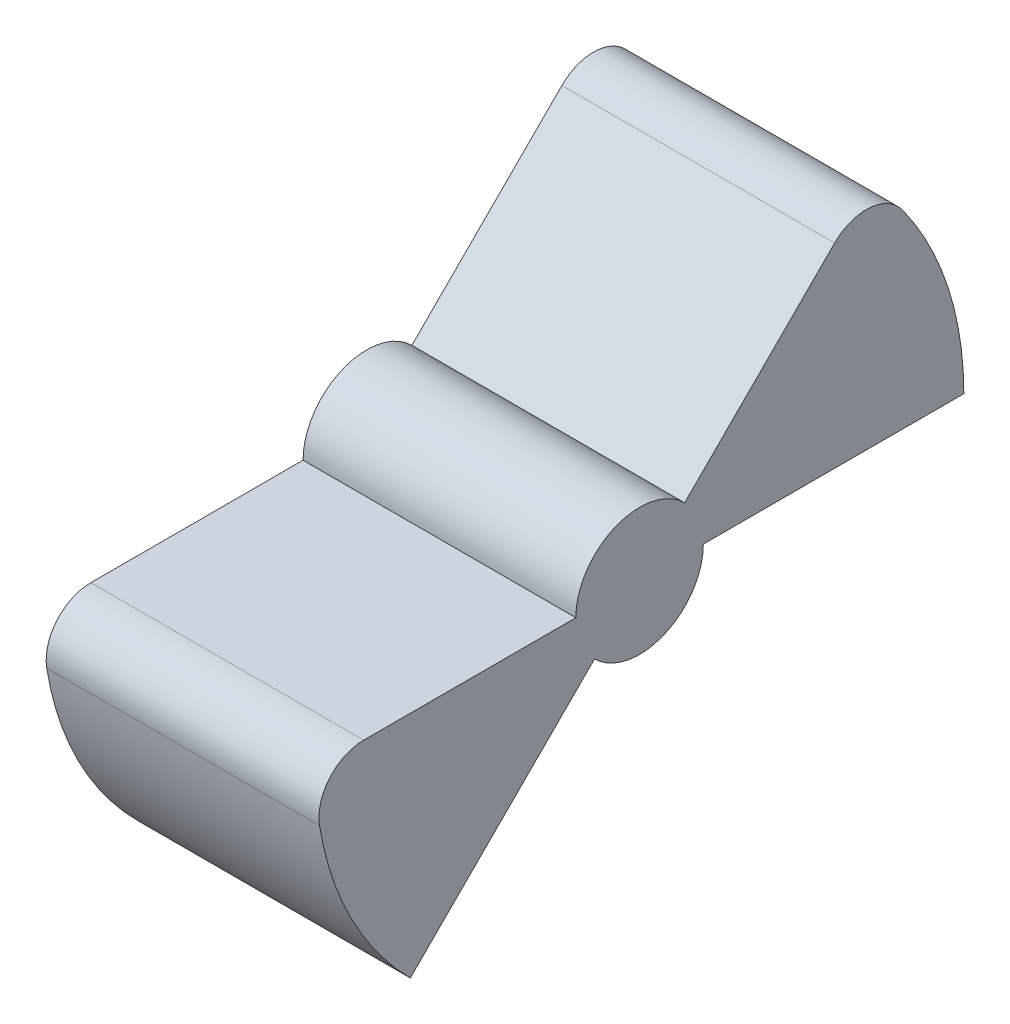
ISO-10303-21;
HEADER;
FILE_DESCRIPTION(('STEP AP214'),'2;1');
FILE_NAME('part.step','',(''),(''),'','','');
FILE_SCHEMA(('AUTOMOTIVE_DESIGN { 1 0 10303 214 1 1 1 1 }'));
ENDSEC;
DATA;
#1=APPLICATION_CONTEXT('core data for automotive mechanical design processes');
#2=APPLICATION_PROTOCOL_DEFINITION('international standard','automotive_design',2000,#1);
#3=PRODUCT_CONTEXT('',#1,'mechanical');
#4=PRODUCT('Part','Part','',(#3));
#5=PRODUCT_RELATED_PRODUCT_CATEGORY('part','',(#4));
#6=PRODUCT_DEFINITION_FORMATION('','',#4);
#7=PRODUCT_DEFINITION_CONTEXT('part definition',#1,'design');
#8=PRODUCT_DEFINITION('design','',#6,#7);
#9=PRODUCT_DEFINITION_SHAPE('','',#8);
#10=(LENGTH_UNIT() NAMED_UNIT(*) SI_UNIT(.MILLI.,.METRE.));
#11=(NAMED_UNIT(*) PLANE_ANGLE_UNIT() SI_UNIT($,.RADIAN.));
#12=(NAMED_UNIT(*) SI_UNIT($,.STERADIAN.) SOLID_ANGLE_UNIT());
#13=UNCERTAINTY_MEASURE_WITH_UNIT(LENGTH_MEASURE(1.E-05),#10,'distance_accuracy_value','');
#14=(GEOMETRIC_REPRESENTATION_CONTEXT(3) GLOBAL_UNCERTAINTY_ASSIGNED_CONTEXT((#13)) GLOBAL_UNIT_ASSIGNED_CONTEXT((#10,
#11,#12)) REPRESENTATION_CONTEXT('',''));
#15=CARTESIAN_POINT('',(0.,0.,0.));
#16=DIRECTION('',(0.,0.,1.));
#17=DIRECTION('',(1.,0.,0.));
#18=AXIS2_PLACEMENT_3D('',#15,#16,#17);
#19=CARTESIAN_POINT('',(6.1,0.,0.));
#20=DIRECTION('',(-1.,0.,0.));
#21=DIRECTION('',(0.,0.,1.));
#22=AXIS2_PLACEMENT_3D('',#19,#20,#21);
#23=CYLINDRICAL_SURFACE('',#22,2.85);
#24=CARTESIAN_POINT('',(-6.1,0.,0.));
#25=DIRECTION('',(1.,0.,0.));
#26=DIRECTION('',(0.,0.,-1.));
#27=AXIS2_PLACEMENT_3D('',#24,#25,#26);
#28=CIRCLE('',#27,2.85);
#29=CARTESIAN_POINT('',(-6.1,2.01525432638165,-2.01525432638167));
#30=VERTEX_POINT('',#29);
#31=CARTESIAN_POINT('',(-6.1,0.,2.85));
#32=VERTEX_POINT('',#31);
#33=EDGE_CURVE('E144',#30,#32,#28,.T.);
#34=ORIENTED_EDGE('',*,*,#33,.T.);
#35=DIRECTION('',(-1.,0.,0.));
#36=VECTOR('',#35,1.);
#37=CARTESIAN_POINT('',(6.1,0.,2.85));
#38=LINE('',#37,#36);
#39=CARTESIAN_POINT('',(6.1,0.,2.85));
#40=VERTEX_POINT('',#39);
#41=EDGE_CURVE('E11',#40,#32,#38,.T.);
#42=ORIENTED_EDGE('',*,*,#41,.F.);
#43=CARTESIAN_POINT('',(6.1,0.,0.));
#44=DIRECTION('',(1.,0.,0.));
#45=DIRECTION('',(0.,0.,-1.));
#46=AXIS2_PLACEMENT_3D('',#43,#44,#45);
#47=CIRCLE('',#46,2.85);
#48=CARTESIAN_POINT('',(6.1,2.01525432638165,-2.01525432638167));
#49=VERTEX_POINT('',#48);
#50=EDGE_CURVE('E162',#49,#40,#47,.T.);
#51=ORIENTED_EDGE('',*,*,#50,.F.);
#52=DIRECTION('',(-1.,0.,0.));
#53=VECTOR('',#52,1.);
#54=CARTESIAN_POINT('',(6.1,2.01525432638165,-2.01525432638167));
#55=LINE('',#54,#53);
#56=EDGE_CURVE('E140',#49,#30,#55,.T.);
#57=ORIENTED_EDGE('',*,*,#56,.T.);
#58=EDGE_LOOP('',(#34,#42,#51,#57));
#59=FACE_BOUND('',#58,.T.);
#60=ADVANCED_FACE('F36',(#59),#23,.T.);
#61=CARTESIAN_POINT('',(6.1,0.,2.85));
#62=DIRECTION('',(0.,-1.,0.));
#63=DIRECTION('',(0.,0.,-1.));
#64=AXIS2_PLACEMENT_3D('',#61,#62,#63);
#65=PLANE('',#64);
#66=DIRECTION('',(0.,0.,1.));
#67=VECTOR('',#66,1.);
#68=CARTESIAN_POINT('',(-6.1,0.,2.85));
#69=LINE('',#68,#67);
#70=CARTESIAN_POINT('',(-6.1,0.,12.3389626792531));
#71=VERTEX_POINT('',#70);
#72=EDGE_CURVE('E147',#32,#71,#69,.T.);
#73=ORIENTED_EDGE('',*,*,#72,.T.);
#74=DIRECTION('',(-1.,0.,0.));
#75=VECTOR('',#74,1.);
#76=CARTESIAN_POINT('',(6.1,0.,12.3389626792531));
#77=LINE('',#76,#75);
#78=CARTESIAN_POINT('',(6.1,0.,12.3389626792531));
#79=VERTEX_POINT('',#78);
#80=EDGE_CURVE('E44',#79,#71,#77,.T.);
#81=ORIENTED_EDGE('',*,*,#80,.F.);
#82=DIRECTION('',(0.,0.,1.));
#83=VECTOR('',#82,1.);
#84=CARTESIAN_POINT('',(6.1,0.,2.85));
#85=LINE('',#84,#83);
#86=EDGE_CURVE('E101',#40,#79,#85,.T.);
#87=ORIENTED_EDGE('',*,*,#86,.F.);
#88=ORIENTED_EDGE('',*,*,#41,.T.);
#89=EDGE_LOOP('',(#73,#81,#87,#88));
#90=FACE_BOUND('',#89,.T.);
#91=ADVANCED_FACE('F211',(#90),#65,.F.);
#92=CARTESIAN_POINT('',(6.1,-2.,12.3389626792531));
#93=DIRECTION('',(-1.,0.,0.));
#94=DIRECTION('',(0.,0.,1.));
#95=AXIS2_PLACEMENT_3D('',#92,#93,#94);
#96=CYLINDRICAL_SURFACE('',#95,2.);
#97=CARTESIAN_POINT('',(-6.1,-2.,12.3389626792531));
#98=DIRECTION('',(1.,0.,0.));
#99=DIRECTION('',(0.,0.,-1.));
#100=AXIS2_PLACEMENT_3D('',#97,#98,#99);
#101=CIRCLE('',#100,2.);
#102=CARTESIAN_POINT('',(-6.1,-2.32,14.3131967079336));
#103=VERTEX_POINT('',#102);
#104=EDGE_CURVE('E149',#71,#103,#101,.T.);
#105=ORIENTED_EDGE('',*,*,#104,.T.);
#106=DIRECTION('',(-1.,0.,0.));
#107=VECTOR('',#106,1.);
#108=CARTESIAN_POINT('',(6.1,-2.32,14.3131967079336));
#109=LINE('',#108,#107);
#110=CARTESIAN_POINT('',(6.1,-2.32,14.3131967079336));
#111=VERTEX_POINT('',#110);
#112=EDGE_CURVE('E175',#111,#103,#109,.T.);
#113=ORIENTED_EDGE('',*,*,#112,.F.);
#114=CARTESIAN_POINT('',(6.1,-2.,12.3389626792531));
#115=DIRECTION('',(1.,0.,0.));
#116=DIRECTION('',(0.,0.,-1.));
#117=AXIS2_PLACEMENT_3D('',#114,#115,#116);
#118=CIRCLE('',#117,2.);
#119=EDGE_CURVE('E183',#79,#111,#118,.T.);
#120=ORIENTED_EDGE('',*,*,#119,.F.);
#121=ORIENTED_EDGE('',*,*,#80,.T.);
#122=EDGE_LOOP('',(#105,#113,#120,#121));
#123=FACE_BOUND('',#122,.T.);
#124=ADVANCED_FACE('F181',(#123),#96,.T.);
#125=CARTESIAN_POINT('',(6.1,0.,0.));
#126=DIRECTION('',(-1.,0.,0.));
#127=DIRECTION('',(0.,0.,1.));
#128=AXIS2_PLACEMENT_3D('',#125,#126,#127);
#129=CYLINDRICAL_SURFACE('',#128,14.5);
#130=CARTESIAN_POINT('',(-6.1,0.,0.));
#131=DIRECTION('',(1.,0.,0.));
#132=DIRECTION('',(0.,0.,-1.));
#133=AXIS2_PLACEMENT_3D('',#130,#131,#132);
#134=CIRCLE('',#133,14.5);
#135=CARTESIAN_POINT('',(-6.1,-10.2530483272049,10.253048327205));
#136=VERTEX_POINT('',#135);
#137=EDGE_CURVE('E151',#103,#136,#134,.T.);
#138=ORIENTED_EDGE('',*,*,#137,.T.);
#139=DIRECTION('',(-1.,0.,0.));
#140=VECTOR('',#139,1.);
#141=CARTESIAN_POINT('',(6.1,-10.2530483272049,10.253048327205));
#142=LINE('',#141,#140);
#143=CARTESIAN_POINT('',(6.1,-10.2530483272049,10.253048327205));
#144=VERTEX_POINT('',#143);
#145=EDGE_CURVE('E172',#144,#136,#142,.T.);
#146=ORIENTED_EDGE('',*,*,#145,.F.);
#147=CARTESIAN_POINT('',(6.1,0.,0.));
#148=DIRECTION('',(1.,0.,0.));
#149=DIRECTION('',(0.,0.,-1.));
#150=AXIS2_PLACEMENT_3D('',#147,#148,#149);
#151=CIRCLE('',#150,14.5);
#152=EDGE_CURVE('E201',#111,#144,#151,.T.);
#153=ORIENTED_EDGE('',*,*,#152,.F.);
#154=ORIENTED_EDGE('',*,*,#112,.T.);
#155=EDGE_LOOP('',(#138,#146,#153,#154));
#156=FACE_BOUND('',#155,.T.);
#157=ADVANCED_FACE('F192',(#156),#129,.T.);
#158=CARTESIAN_POINT('',(6.1,-2.01525432638165,2.01525432638167));
#159=DIRECTION('',(0.,0.707106781186551,0.707106781186544));
#160=DIRECTION('',(0.,-0.707106781186544,0.707106781186551));
#161=AXIS2_PLACEMENT_3D('',#158,#159,#160);
#162=PLANE('',#161);
#163=DIRECTION('',(0.,0.707106781186544,-0.707106781186551));
#164=VECTOR('',#163,1.);
#165=CARTESIAN_POINT('',(-6.1,-2.01525432638165,2.01525432638167));
#166=LINE('',#165,#164);
#167=CARTESIAN_POINT('',(-6.1,-2.01525432638165,2.01525432638167));
#168=VERTEX_POINT('',#167);
#169=EDGE_CURVE('E153',#136,#168,#166,.T.);
#170=ORIENTED_EDGE('',*,*,#169,.T.);
#171=DIRECTION('',(-1.,0.,0.));
#172=VECTOR('',#171,1.);
#173=CARTESIAN_POINT('',(6.1,-2.01525432638165,2.01525432638167));
#174=LINE('',#173,#172);
#175=CARTESIAN_POINT('',(6.1,-2.01525432638165,2.01525432638167));
#176=VERTEX_POINT('',#175);
#177=EDGE_CURVE('E169',#176,#168,#174,.T.);
#178=ORIENTED_EDGE('',*,*,#177,.F.);
#179=DIRECTION('',(0.,0.707106781186544,-0.707106781186551));
#180=VECTOR('',#179,1.);
#181=CARTESIAN_POINT('',(6.1,-2.01525432638165,2.01525432638167));
#182=LINE('',#181,#180);
#183=EDGE_CURVE('E198',#144,#176,#182,.T.);
#184=ORIENTED_EDGE('',*,*,#183,.F.);
#185=ORIENTED_EDGE('',*,*,#145,.T.);
#186=EDGE_LOOP('',(#170,#178,#184,#185));
#187=FACE_BOUND('',#186,.T.);
#188=ADVANCED_FACE('F196',(#187),#162,.F.);
#189=CARTESIAN_POINT('',(6.1,0.,0.));
#190=DIRECTION('',(-1.,0.,0.));
#191=DIRECTION('',(0.,0.,1.));
#192=AXIS2_PLACEMENT_3D('',#189,#190,#191);
#193=CYLINDRICAL_SURFACE('',#192,2.85);
#194=CARTESIAN_POINT('',(-6.1,0.,0.));
#195=DIRECTION('',(1.,0.,0.));
#196=DIRECTION('',(0.,0.,-1.));
#197=AXIS2_PLACEMENT_3D('',#194,#195,#196);
#198=CIRCLE('',#197,2.85);
#199=CARTESIAN_POINT('',(-6.1,0.,-2.85));
#200=VERTEX_POINT('',#199);
#201=EDGE_CURVE('E155',#168,#200,#198,.T.);
#202=ORIENTED_EDGE('',*,*,#201,.T.);
#203=DIRECTION('',(-1.,0.,0.));
#204=VECTOR('',#203,1.);
#205=CARTESIAN_POINT('',(6.1,0.,-2.85));
#206=LINE('',#205,#204);
#207=CARTESIAN_POINT('',(6.1,0.,-2.85));
#208=VERTEX_POINT('',#207);
#209=EDGE_CURVE('E166',#208,#200,#206,.T.);
#210=ORIENTED_EDGE('',*,*,#209,.F.);
#211=CARTESIAN_POINT('',(6.1,0.,0.));
#212=DIRECTION('',(1.,0.,0.));
#213=DIRECTION('',(0.,0.,-1.));
#214=AXIS2_PLACEMENT_3D('',#211,#212,#213);
#215=CIRCLE('',#214,2.85);
#216=EDGE_CURVE('E200',#176,#208,#215,.T.);
#217=ORIENTED_EDGE('',*,*,#216,.F.);
#218=ORIENTED_EDGE('',*,*,#177,.T.);
#219=EDGE_LOOP('',(#202,#210,#217,#218));
#220=FACE_BOUND('',#219,.T.);
#221=ADVANCED_FACE('F223',(#220),#193,.T.);
#222=CARTESIAN_POINT('',(6.1,0.,-14.5));
#223=DIRECTION('',(0.,1.,0.));
#224=DIRECTION('',(0.,0.,1.));
#225=AXIS2_PLACEMENT_3D('',#222,#223,#224);
#226=PLANE('',#225);
#227=DIRECTION('',(0.,0.,-1.));
#228=VECTOR('',#227,1.);
#229=CARTESIAN_POINT('',(-6.1,0.,-14.5));
#230=LINE('',#229,#228);
#231=CARTESIAN_POINT('',(-6.1,0.,-14.5));
#232=VERTEX_POINT('',#231);
#233=EDGE_CURVE('E157',#200,#232,#230,.T.);
#234=ORIENTED_EDGE('',*,*,#233,.T.);
#235=DIRECTION('',(-1.,0.,0.));
#236=VECTOR('',#235,1.);
#237=CARTESIAN_POINT('',(6.1,0.,-14.5));
#238=LINE('',#237,#236);
#239=CARTESIAN_POINT('',(6.1,0.,-14.5));
#240=VERTEX_POINT('',#239);
#241=EDGE_CURVE('E135',#240,#232,#238,.T.);
#242=ORIENTED_EDGE('',*,*,#241,.F.);
#243=DIRECTION('',(0.,0.,-1.));
#244=VECTOR('',#243,1.);
#245=CARTESIAN_POINT('',(6.1,0.,-14.5));
#246=LINE('',#245,#244);
#247=EDGE_CURVE('E126',#208,#240,#246,.T.);
#248=ORIENTED_EDGE('',*,*,#247,.F.);
#249=ORIENTED_EDGE('',*,*,#209,.T.);
#250=EDGE_LOOP('',(#234,#242,#248,#249));
#251=FACE_BOUND('',#250,.T.);
#252=ADVANCED_FACE('F226',(#251),#226,.F.);
#253=CARTESIAN_POINT('',(6.1,0.,0.));
#254=DIRECTION('',(-1.,0.,0.));
#255=DIRECTION('',(0.,0.,1.));
#256=AXIS2_PLACEMENT_3D('',#253,#254,#255);
#257=CYLINDRICAL_SURFACE('',#256,14.5);
#258=CARTESIAN_POINT('',(-6.1,0.,0.));
#259=DIRECTION('',(1.,0.,0.));
#260=DIRECTION('',(0.,0.,-1.));
#261=AXIS2_PLACEMENT_3D('',#258,#259,#260);
#262=CIRCLE('',#261,14.5);
#263=CARTESIAN_POINT('',(-6.1,8.48047072028394,-11.7614461849896));
#264=VERTEX_POINT('',#263);
#265=EDGE_CURVE('E134',#232,#264,#262,.T.);
#266=ORIENTED_EDGE('',*,*,#265,.T.);
#267=DIRECTION('',(-1.,0.,0.));
#268=VECTOR('',#267,1.);
#269=CARTESIAN_POINT('',(6.1,8.48047072028394,-11.7614461849896));
#270=LINE('',#269,#268);
#271=CARTESIAN_POINT('',(6.1,8.48047072028394,-11.7614461849896));
#272=VERTEX_POINT('',#271);
#273=EDGE_CURVE('E131',#272,#264,#270,.T.);
#274=ORIENTED_EDGE('',*,*,#273,.F.);
#275=CARTESIAN_POINT('',(6.1,0.,0.));
#276=DIRECTION('',(1.,0.,0.));
#277=DIRECTION('',(0.,0.,-1.));
#278=AXIS2_PLACEMENT_3D('',#275,#276,#277);
#279=CIRCLE('',#278,14.5);
#280=EDGE_CURVE('E120',#240,#272,#279,.T.);
#281=ORIENTED_EDGE('',*,*,#280,.F.);
#282=ORIENTED_EDGE('',*,*,#241,.T.);
#283=EDGE_LOOP('',(#266,#274,#281,#282));
#284=FACE_BOUND('',#283,.T.);
#285=ADVANCED_FACE('F132',(#284),#257,.T.);
#286=CARTESIAN_POINT('',(6.1,7.31075062093443,-10.1391777456807));
#287=DIRECTION('',(-1.,0.,0.));
#288=DIRECTION('',(0.,0.,1.));
#289=AXIS2_PLACEMENT_3D('',#286,#287,#288);
#290=CYLINDRICAL_SURFACE('',#289,2.);
#291=CARTESIAN_POINT('',(-6.1,7.31075062093443,-10.1391777456807));
#292=DIRECTION('',(1.,0.,0.));
#293=DIRECTION('',(0.,0.,1.));
#294=AXIS2_PLACEMENT_3D('',#291,#292,#293);
#295=CIRCLE('',#294,2.);
#296=CARTESIAN_POINT('',(-6.1,8.72496418330753,-8.72496418330762));
#297=VERTEX_POINT('',#296);
#298=EDGE_CURVE('E87',#264,#297,#295,.T.);
#299=ORIENTED_EDGE('',*,*,#298,.T.);
#300=DIRECTION('',(-1.,0.,0.));
#301=VECTOR('',#300,1.);
#302=CARTESIAN_POINT('',(6.1,8.72496418330753,-8.72496418330762));
#303=LINE('',#302,#301);
#304=CARTESIAN_POINT('',(6.1,8.72496418330753,-8.72496418330762));
#305=VERTEX_POINT('',#304);
#306=EDGE_CURVE('E136',#305,#297,#303,.T.);
#307=ORIENTED_EDGE('',*,*,#306,.F.);
#308=CARTESIAN_POINT('',(6.1,7.31075062093443,-10.1391777456807));
#309=DIRECTION('',(1.,0.,0.));
#310=DIRECTION('',(0.,0.,1.));
#311=AXIS2_PLACEMENT_3D('',#308,#309,#310);
#312=CIRCLE('',#311,2.);
#313=EDGE_CURVE('E124',#272,#305,#312,.T.);
#314=ORIENTED_EDGE('',*,*,#313,.F.);
#315=ORIENTED_EDGE('',*,*,#273,.T.);
#316=EDGE_LOOP('',(#299,#307,#314,#315));
#317=FACE_BOUND('',#316,.T.);
#318=ADVANCED_FACE('F138',(#317),#290,.T.);
#319=CARTESIAN_POINT('',(6.1,2.01525432638165,-2.01525432638167));
#320=DIRECTION('',(0.,-0.707106781186551,-0.707106781186544));
#321=DIRECTION('',(0.,0.707106781186544,-0.707106781186551));
#322=AXIS2_PLACEMENT_3D('',#319,#320,#321);
#323=PLANE('',#322);
#324=DIRECTION('',(0.,-0.707106781186544,0.707106781186551));
#325=VECTOR('',#324,1.);
#326=CARTESIAN_POINT('',(-6.1,2.01525432638165,-2.01525432638167));
#327=LINE('',#326,#325);
#328=EDGE_CURVE('E93',#297,#30,#327,.T.);
#329=ORIENTED_EDGE('',*,*,#328,.T.);
#330=ORIENTED_EDGE('',*,*,#56,.F.);
#331=DIRECTION('',(0.,-0.707106781186544,0.707106781186551));
#332=VECTOR('',#331,1.);
#333=CARTESIAN_POINT('',(6.1,2.01525432638165,-2.01525432638167));
#334=LINE('',#333,#332);
#335=EDGE_CURVE('E52',#305,#49,#334,.T.);
#336=ORIENTED_EDGE('',*,*,#335,.F.);
#337=ORIENTED_EDGE('',*,*,#306,.T.);
#338=EDGE_LOOP('',(#329,#330,#336,#337));
#339=FACE_BOUND('',#338,.T.);
#340=ADVANCED_FACE('F235',(#339),#323,.F.);
#341=CARTESIAN_POINT('',(6.1,0.,0.));
#342=DIRECTION('',(1.,0.,0.));
#343=DIRECTION('',(0.,0.,-1.));
#344=AXIS2_PLACEMENT_3D('',#341,#342,#343);
#345=PLANE('',#344);
#346=ORIENTED_EDGE('',*,*,#50,.T.);
#347=ORIENTED_EDGE('',*,*,#86,.T.);
#348=ORIENTED_EDGE('',*,*,#119,.T.);
#349=ORIENTED_EDGE('',*,*,#152,.T.);
#350=ORIENTED_EDGE('',*,*,#183,.T.);
#351=ORIENTED_EDGE('',*,*,#216,.T.);
#352=ORIENTED_EDGE('',*,*,#247,.T.);
#353=ORIENTED_EDGE('',*,*,#280,.T.);
#354=ORIENTED_EDGE('',*,*,#313,.T.);
#355=ORIENTED_EDGE('',*,*,#335,.T.);
#356=EDGE_LOOP('',(#346,#347,#348,#349,#350,#351,#352,#353,#354,#355));
#357=FACE_BOUND('',#356,.T.);
#358=ADVANCED_FACE('F122',(#357),#345,.T.);
#359=CARTESIAN_POINT('',(-6.1,0.,0.));
#360=DIRECTION('',(1.,0.,0.));
#361=DIRECTION('',(0.,0.,-1.));
#362=AXIS2_PLACEMENT_3D('',#359,#360,#361);
#363=PLANE('',#362);
#364=ORIENTED_EDGE('',*,*,#33,.F.);
#365=ORIENTED_EDGE('',*,*,#328,.F.);
#366=ORIENTED_EDGE('',*,*,#298,.F.);
#367=ORIENTED_EDGE('',*,*,#265,.F.);
#368=ORIENTED_EDGE('',*,*,#233,.F.);
#369=ORIENTED_EDGE('',*,*,#201,.F.);
#370=ORIENTED_EDGE('',*,*,#169,.F.);
#371=ORIENTED_EDGE('',*,*,#137,.F.);
#372=ORIENTED_EDGE('',*,*,#104,.F.);
#373=ORIENTED_EDGE('',*,*,#72,.F.);
#374=EDGE_LOOP('',(#364,#365,#366,#367,#368,#369,#370,#371,#372,#373));
#375=FACE_BOUND('',#374,.T.);
#376=ADVANCED_FACE('F187',(#375),#363,.F.);
#377=CLOSED_SHELL('',(#60,#91,#124,#157,#188,#221,#252,#285,#318,#340,#358,#376));
#378=MANIFOLD_SOLID_BREP('B2',#377);
#379=ADVANCED_BREP_SHAPE_REPRESENTATION('',(#18,#378),#14);
#380=SHAPE_DEFINITION_REPRESENTATION(#9,#379);
ENDSEC;
END-ISO-10303-21;
